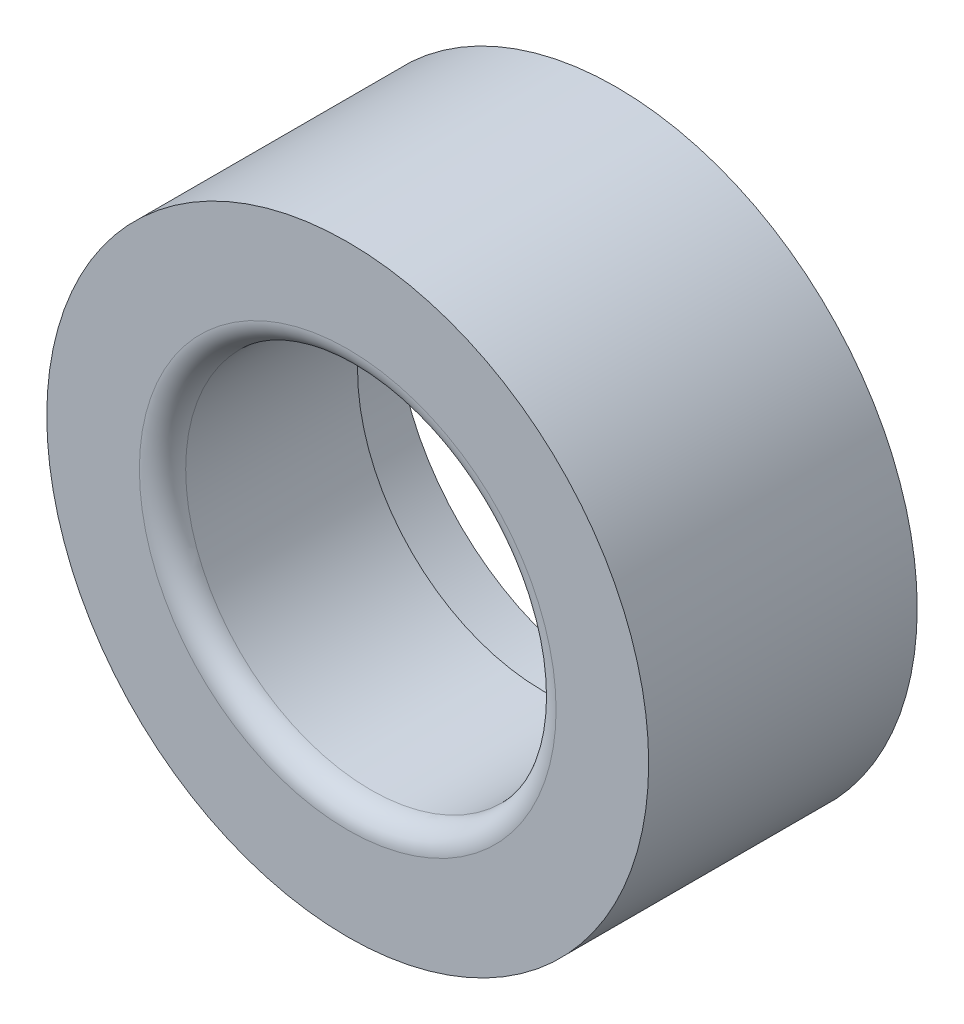
ISO-10303-21;
HEADER;
FILE_DESCRIPTION(('STEP AP214'),'2;1');
FILE_NAME('part.step','',(''),(''),'','','');
FILE_SCHEMA(('AUTOMOTIVE_DESIGN { 1 0 10303 214 1 1 1 1 }'));
ENDSEC;
DATA;
#1=APPLICATION_CONTEXT('core data for automotive mechanical design processes');
#2=APPLICATION_PROTOCOL_DEFINITION('international standard','automotive_design',2000,#1);
#3=PRODUCT_CONTEXT('',#1,'mechanical');
#4=PRODUCT('Part','Part','',(#3));
#5=PRODUCT_RELATED_PRODUCT_CATEGORY('part','',(#4));
#6=PRODUCT_DEFINITION_FORMATION('','',#4);
#7=PRODUCT_DEFINITION_CONTEXT('part definition',#1,'design');
#8=PRODUCT_DEFINITION('design','',#6,#7);
#9=PRODUCT_DEFINITION_SHAPE('','',#8);
#10=(LENGTH_UNIT() NAMED_UNIT(*) SI_UNIT(.MILLI.,.METRE.));
#11=(NAMED_UNIT(*) PLANE_ANGLE_UNIT() SI_UNIT($,.RADIAN.));
#12=(NAMED_UNIT(*) SI_UNIT($,.STERADIAN.) SOLID_ANGLE_UNIT());
#13=UNCERTAINTY_MEASURE_WITH_UNIT(LENGTH_MEASURE(1.E-05),#10,'distance_accuracy_value','');
#14=(GEOMETRIC_REPRESENTATION_CONTEXT(3) GLOBAL_UNCERTAINTY_ASSIGNED_CONTEXT((#13)) GLOBAL_UNIT_ASSIGNED_CONTEXT((#10,
#11,#12)) REPRESENTATION_CONTEXT('',''));
#15=CARTESIAN_POINT('',(0.,0.,0.));
#16=DIRECTION('',(0.,0.,1.));
#17=DIRECTION('',(1.,0.,0.));
#18=AXIS2_PLACEMENT_3D('',#15,#16,#17);
#19=CARTESIAN_POINT('',(85.2065274133614,-1.76399781545092,0.));
#20=DIRECTION('',(0.,0.,1.));
#21=DIRECTION('',(1.,0.,0.));
#22=AXIS2_PLACEMENT_3D('',#19,#20,#21);
#23=CYLINDRICAL_SURFACE('',#22,4.00000000000001);
#24=CARTESIAN_POINT('',(85.2065274133614,-1.76399781545092,5.3));
#25=DIRECTION('',(0.,0.,1.));
#26=DIRECTION('',(1.,0.,0.));
#27=AXIS2_PLACEMENT_3D('',#24,#25,#26);
#28=CIRCLE('',#27,4.00000000000001);
#29=CARTESIAN_POINT('',(89.2065274133614,-1.76399781545092,5.3));
#30=VERTEX_POINT('',#29);
#31=EDGE_CURVE('E48',#30,#30,#28,.T.);
#32=ORIENTED_EDGE('',*,*,#31,.T.);
#33=EDGE_LOOP('',(#32));
#34=FACE_BOUND('',#33,.T.);
#35=CARTESIAN_POINT('',(85.2065274133614,-1.76399781545092,1.5875));
#36=DIRECTION('',(0.,0.,-1.));
#37=DIRECTION('',(-1.,0.,0.));
#38=AXIS2_PLACEMENT_3D('',#35,#36,#37);
#39=CIRCLE('',#38,4.00000000000001);
#40=CARTESIAN_POINT('',(81.2065274133614,-1.76399781545092,1.5875));
#41=VERTEX_POINT('',#40);
#42=EDGE_CURVE('E43',#41,#41,#39,.F.);
#43=ORIENTED_EDGE('',*,*,#42,.F.);
#44=EDGE_LOOP('',(#43));
#45=FACE_BOUND('',#44,.T.);
#46=ADVANCED_FACE('F39',(#34,#45),#23,.F.);
#47=CARTESIAN_POINT('',(85.2065274133614,-1.76399781545092,5.8));
#48=DIRECTION('',(0.,0.,-1.));
#49=DIRECTION('',(-1.,0.,0.));
#50=AXIS2_PLACEMENT_3D('',#47,#48,#49);
#51=CYLINDRICAL_SURFACE('',#50,6.5);
#52=CARTESIAN_POINT('',(85.2065274133614,-1.76399781545092,5.8));
#53=DIRECTION('',(0.,0.,1.));
#54=DIRECTION('',(1.,0.,0.));
#55=AXIS2_PLACEMENT_3D('',#52,#53,#54);
#56=CIRCLE('',#55,6.5);
#57=CARTESIAN_POINT('',(91.7065274133614,-1.76399781545092,5.8));
#58=VERTEX_POINT('',#57);
#59=EDGE_CURVE('E53',#58,#58,#56,.T.);
#60=ORIENTED_EDGE('',*,*,#59,.F.);
#61=EDGE_LOOP('',(#60));
#62=FACE_BOUND('',#61,.T.);
#63=CARTESIAN_POINT('',(85.2065274133614,-1.76399781545092,0.));
#64=DIRECTION('',(0.,0.,1.));
#65=DIRECTION('',(1.,0.,0.));
#66=AXIS2_PLACEMENT_3D('',#63,#64,#65);
#67=CIRCLE('',#66,6.5);
#68=CARTESIAN_POINT('',(91.7065274133614,-1.76399781545092,0.));
#69=VERTEX_POINT('',#68);
#70=EDGE_CURVE('E56',#69,#69,#67,.T.);
#71=ORIENTED_EDGE('',*,*,#70,.T.);
#72=EDGE_LOOP('',(#71));
#73=FACE_BOUND('',#72,.T.);
#74=ADVANCED_FACE('F79',(#62,#73),#51,.T.);
#75=CARTESIAN_POINT('',(85.2065274133614,-1.76399781545092,5.8));
#76=DIRECTION('',(0.,0.,1.));
#77=DIRECTION('',(1.,0.,0.));
#78=AXIS2_PLACEMENT_3D('',#75,#76,#77);
#79=PLANE('',#78);
#80=CARTESIAN_POINT('',(85.2065274133614,-1.76399781545092,5.8));
#81=DIRECTION('',(0.,0.,1.));
#82=DIRECTION('',(1.,0.,0.));
#83=AXIS2_PLACEMENT_3D('',#80,#81,#82);
#84=CIRCLE('',#83,4.50000000000001);
#85=CARTESIAN_POINT('',(89.7065274133614,-1.76399781545092,5.8));
#86=VERTEX_POINT('',#85);
#87=EDGE_CURVE('E10',#86,#86,#84,.F.);
#88=ORIENTED_EDGE('',*,*,#87,.T.);
#89=EDGE_LOOP('',(#88));
#90=FACE_BOUND('',#89,.T.);
#91=ORIENTED_EDGE('',*,*,#59,.T.);
#92=EDGE_LOOP('',(#91));
#93=FACE_BOUND('',#92,.T.);
#94=ADVANCED_FACE('F85',(#90,#93),#79,.T.);
#95=CARTESIAN_POINT('',(85.2065274133614,-1.76399781545092,0.));
#96=DIRECTION('',(0.,0.,1.));
#97=DIRECTION('',(1.,0.,0.));
#98=AXIS2_PLACEMENT_3D('',#95,#96,#97);
#99=PLANE('',#98);
#100=CARTESIAN_POINT('',(85.2065274133614,-1.76399781545092,0.));
#101=DIRECTION('',(0.,0.,-1.));
#102=DIRECTION('',(-1.,0.,0.));
#103=AXIS2_PLACEMENT_3D('',#100,#101,#102);
#104=CIRCLE('',#103,4.775);
#105=CARTESIAN_POINT('',(80.4315274133614,-1.76399781545092,0.));
#106=VERTEX_POINT('',#105);
#107=EDGE_CURVE('E63',#106,#106,#104,.T.);
#108=ORIENTED_EDGE('',*,*,#107,.F.);
#109=EDGE_LOOP('',(#108));
#110=FACE_BOUND('',#109,.T.);
#111=ORIENTED_EDGE('',*,*,#70,.F.);
#112=EDGE_LOOP('',(#111));
#113=FACE_BOUND('',#112,.T.);
#114=ADVANCED_FACE('F93',(#110,#113),#99,.F.);
#115=CARTESIAN_POINT('',(85.2065274133614,-1.76399781545092,5.3));
#116=DIRECTION('',(0.,0.,1.));
#117=DIRECTION('',(1.,0.,0.));
#118=AXIS2_PLACEMENT_3D('',#115,#116,#117);
#119=TOROIDAL_SURFACE('',#118,4.50000000000001,0.5);
#120=ORIENTED_EDGE('',*,*,#87,.F.);
#121=EDGE_LOOP('',(#120));
#122=FACE_BOUND('',#121,.T.);
#123=ORIENTED_EDGE('',*,*,#31,.F.);
#124=EDGE_LOOP('',(#123));
#125=FACE_BOUND('',#124,.T.);
#126=ADVANCED_FACE('F41',(#122,#125),#119,.T.);
#127=CARTESIAN_POINT('',(85.2065274133614,-1.76399781545092,1.5875));
#128=DIRECTION('',(0.,0.,-1.));
#129=DIRECTION('',(-1.,0.,0.));
#130=AXIS2_PLACEMENT_3D('',#127,#128,#129);
#131=PLANE('',#130);
#132=CARTESIAN_POINT('',(85.2065274133614,-1.76399781545092,1.5875));
#133=DIRECTION('',(0.,0.,-1.));
#134=DIRECTION('',(-1.,0.,0.));
#135=AXIS2_PLACEMENT_3D('',#132,#133,#134);
#136=CIRCLE('',#135,4.775);
#137=CARTESIAN_POINT('',(80.4315274133614,-1.76399781545092,1.5875));
#138=VERTEX_POINT('',#137);
#139=EDGE_CURVE('E67',#138,#138,#136,.T.);
#140=ORIENTED_EDGE('',*,*,#139,.T.);
#141=EDGE_LOOP('',(#140));
#142=FACE_BOUND('',#141,.T.);
#143=ORIENTED_EDGE('',*,*,#42,.T.);
#144=EDGE_LOOP('',(#143));
#145=FACE_BOUND('',#144,.T.);
#146=ADVANCED_FACE('F76',(#142,#145),#131,.T.);
#147=CARTESIAN_POINT('',(85.2065274133614,-1.76399781545092,1.5875));
#148=DIRECTION('',(0.,0.,-1.));
#149=DIRECTION('',(-1.,0.,0.));
#150=AXIS2_PLACEMENT_3D('',#147,#148,#149);
#151=CYLINDRICAL_SURFACE('',#150,4.775);
#152=ORIENTED_EDGE('',*,*,#139,.F.);
#153=EDGE_LOOP('',(#152));
#154=FACE_BOUND('',#153,.T.);
#155=ORIENTED_EDGE('',*,*,#107,.T.);
#156=EDGE_LOOP('',(#155));
#157=FACE_BOUND('',#156,.T.);
#158=ADVANCED_FACE('F89',(#154,#157),#151,.F.);
#159=CLOSED_SHELL('',(#46,#74,#94,#114,#126,#146,#158));
#160=MANIFOLD_SOLID_BREP('B2',#159);
#161=ADVANCED_BREP_SHAPE_REPRESENTATION('',(#18,#160),#14);
#162=SHAPE_DEFINITION_REPRESENTATION(#9,#161);
ENDSEC;
END-ISO-10303-21;
